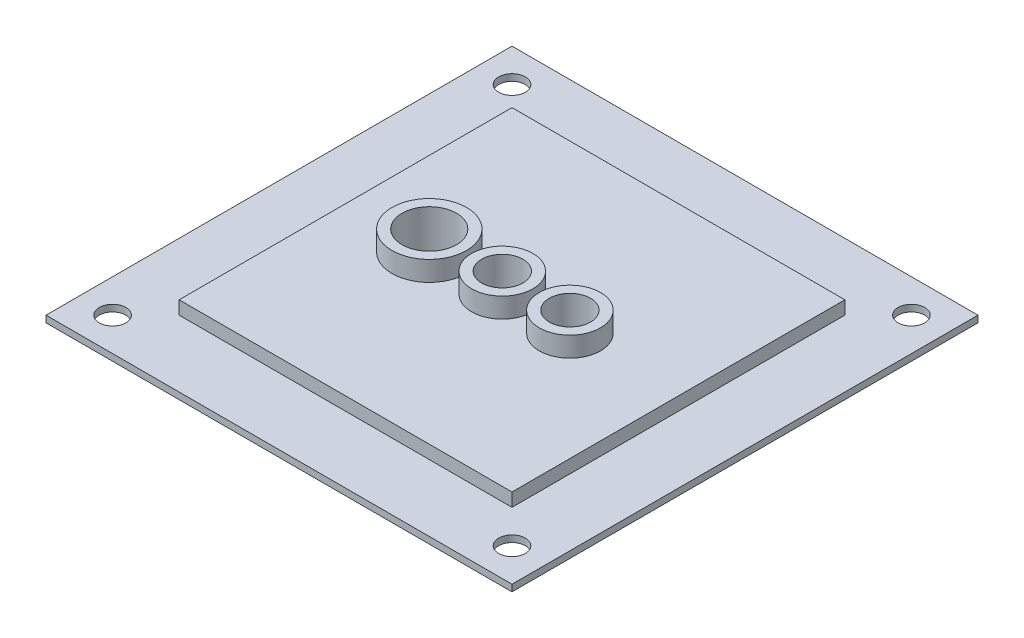
ISO-10303-21;
HEADER;
FILE_DESCRIPTION(('STEP AP214'),'2;1');
FILE_NAME('part.step','',(''),(''),'','','');
FILE_SCHEMA(('AUTOMOTIVE_DESIGN { 1 0 10303 214 1 1 1 1 }'));
ENDSEC;
DATA;
#1=APPLICATION_CONTEXT('core data for automotive mechanical design processes');
#2=APPLICATION_PROTOCOL_DEFINITION('international standard','automotive_design',2000,#1);
#3=PRODUCT_CONTEXT('',#1,'mechanical');
#4=PRODUCT('Part','Part','',(#3));
#5=PRODUCT_RELATED_PRODUCT_CATEGORY('part','',(#4));
#6=PRODUCT_DEFINITION_FORMATION('','',#4);
#7=PRODUCT_DEFINITION_CONTEXT('part definition',#1,'design');
#8=PRODUCT_DEFINITION('design','',#6,#7);
#9=PRODUCT_DEFINITION_SHAPE('','',#8);
#10=(LENGTH_UNIT() NAMED_UNIT(*) SI_UNIT(.MILLI.,.METRE.));
#11=(NAMED_UNIT(*) PLANE_ANGLE_UNIT() SI_UNIT($,.RADIAN.));
#12=(NAMED_UNIT(*) SI_UNIT($,.STERADIAN.) SOLID_ANGLE_UNIT());
#13=UNCERTAINTY_MEASURE_WITH_UNIT(LENGTH_MEASURE(1.E-05),#10,'distance_accuracy_value','');
#14=(GEOMETRIC_REPRESENTATION_CONTEXT(3) GLOBAL_UNCERTAINTY_ASSIGNED_CONTEXT((#13)) GLOBAL_UNIT_ASSIGNED_CONTEXT((#10,
#11,#12)) REPRESENTATION_CONTEXT('',''));
#15=CARTESIAN_POINT('',(0.,0.,0.));
#16=DIRECTION('',(0.,0.,1.));
#17=DIRECTION('',(1.,0.,0.));
#18=AXIS2_PLACEMENT_3D('',#15,#16,#17);
#19=CARTESIAN_POINT('',(-25.,1.5,0.));
#20=DIRECTION('',(1.,0.,0.));
#21=DIRECTION('',(0.,0.,-1.));
#22=AXIS2_PLACEMENT_3D('',#19,#20,#21);
#23=PLANE('',#22);
#24=DIRECTION('',(0.,0.,-1.));
#25=VECTOR('',#24,1.);
#26=CARTESIAN_POINT('',(-25.,-0.5,0.));
#27=LINE('',#26,#25);
#28=CARTESIAN_POINT('',(-25.,-0.5,0.));
#29=VERTEX_POINT('',#28);
#30=CARTESIAN_POINT('',(-25.,-0.5,-50.));
#31=VERTEX_POINT('',#30);
#32=EDGE_CURVE('E69',#29,#31,#27,.T.);
#33=ORIENTED_EDGE('',*,*,#32,.F.);
#34=DIRECTION('',(0.,-1.,0.));
#35=VECTOR('',#34,1.);
#36=CARTESIAN_POINT('',(-25.,1.5,0.));
#37=LINE('',#36,#35);
#38=CARTESIAN_POINT('',(-25.,1.5,0.));
#39=VERTEX_POINT('',#38);
#40=EDGE_CURVE('E12',#39,#29,#37,.T.);
#41=ORIENTED_EDGE('',*,*,#40,.F.);
#42=DIRECTION('',(0.,0.,1.));
#43=VECTOR('',#42,1.);
#44=CARTESIAN_POINT('',(-25.,1.5,0.));
#45=LINE('',#44,#43);
#46=CARTESIAN_POINT('',(-25.,1.5,-50.));
#47=VERTEX_POINT('',#46);
#48=EDGE_CURVE('E211',#47,#39,#45,.T.);
#49=ORIENTED_EDGE('',*,*,#48,.F.);
#50=DIRECTION('',(0.,-1.,0.));
#51=VECTOR('',#50,1.);
#52=CARTESIAN_POINT('',(-25.,1.5,-50.));
#53=LINE('',#52,#51);
#54=EDGE_CURVE('E130',#47,#31,#53,.T.);
#55=ORIENTED_EDGE('',*,*,#54,.T.);
#56=EDGE_LOOP('',(#33,#41,#49,#55));
#57=FACE_BOUND('',#56,.T.);
#58=ADVANCED_FACE('F55',(#57),#23,.F.);
#59=CARTESIAN_POINT('',(25.,1.5,0.));
#60=DIRECTION('',(0.,0.,-1.));
#61=DIRECTION('',(-1.,0.,0.));
#62=AXIS2_PLACEMENT_3D('',#59,#60,#61);
#63=PLANE('',#62);
#64=DIRECTION('',(-1.,0.,0.));
#65=VECTOR('',#64,1.);
#66=CARTESIAN_POINT('',(25.,-0.5,0.));
#67=LINE('',#66,#65);
#68=CARTESIAN_POINT('',(25.,-0.5,0.));
#69=VERTEX_POINT('',#68);
#70=EDGE_CURVE('E75',#69,#29,#67,.T.);
#71=ORIENTED_EDGE('',*,*,#70,.F.);
#72=DIRECTION('',(0.,-1.,0.));
#73=VECTOR('',#72,1.);
#74=CARTESIAN_POINT('',(25.,1.5,0.));
#75=LINE('',#74,#73);
#76=CARTESIAN_POINT('',(25.,1.5,0.));
#77=VERTEX_POINT('',#76);
#78=EDGE_CURVE('E62',#77,#69,#75,.T.);
#79=ORIENTED_EDGE('',*,*,#78,.F.);
#80=DIRECTION('',(1.,0.,0.));
#81=VECTOR('',#80,1.);
#82=CARTESIAN_POINT('',(25.,1.5,0.));
#83=LINE('',#82,#81);
#84=EDGE_CURVE('E214',#39,#77,#83,.T.);
#85=ORIENTED_EDGE('',*,*,#84,.F.);
#86=ORIENTED_EDGE('',*,*,#40,.T.);
#87=EDGE_LOOP('',(#71,#79,#85,#86));
#88=FACE_BOUND('',#87,.T.);
#89=ADVANCED_FACE('F223',(#88),#63,.F.);
#90=CARTESIAN_POINT('',(25.,1.5,0.));
#91=DIRECTION('',(-1.,0.,0.));
#92=DIRECTION('',(0.,0.,1.));
#93=AXIS2_PLACEMENT_3D('',#90,#91,#92);
#94=PLANE('',#93);
#95=DIRECTION('',(0.,0.,1.));
#96=VECTOR('',#95,1.);
#97=CARTESIAN_POINT('',(25.,-0.5,-50.));
#98=LINE('',#97,#96);
#99=CARTESIAN_POINT('',(25.,-0.5,-50.));
#100=VERTEX_POINT('',#99);
#101=EDGE_CURVE('E133',#100,#69,#98,.T.);
#102=ORIENTED_EDGE('',*,*,#101,.F.);
#103=DIRECTION('',(0.,-1.,0.));
#104=VECTOR('',#103,1.);
#105=CARTESIAN_POINT('',(25.,1.5,-50.));
#106=LINE('',#105,#104);
#107=CARTESIAN_POINT('',(25.,1.5,-50.));
#108=VERTEX_POINT('',#107);
#109=EDGE_CURVE('E121',#108,#100,#106,.T.);
#110=ORIENTED_EDGE('',*,*,#109,.F.);
#111=DIRECTION('',(0.,0.,-1.));
#112=VECTOR('',#111,1.);
#113=CARTESIAN_POINT('',(25.,1.5,0.));
#114=LINE('',#113,#112);
#115=EDGE_CURVE('E216',#77,#108,#114,.T.);
#116=ORIENTED_EDGE('',*,*,#115,.F.);
#117=ORIENTED_EDGE('',*,*,#78,.T.);
#118=EDGE_LOOP('',(#102,#110,#116,#117));
#119=FACE_BOUND('',#118,.T.);
#120=ADVANCED_FACE('F134',(#119),#94,.F.);
#121=CARTESIAN_POINT('',(25.,1.5,-50.));
#122=DIRECTION('',(0.,0.,1.));
#123=DIRECTION('',(1.,0.,0.));
#124=AXIS2_PLACEMENT_3D('',#121,#122,#123);
#125=PLANE('',#124);
#126=DIRECTION('',(1.,0.,0.));
#127=VECTOR('',#126,1.);
#128=CARTESIAN_POINT('',(-25.,-0.5,-50.));
#129=LINE('',#128,#127);
#130=EDGE_CURVE('E126',#31,#100,#129,.T.);
#131=ORIENTED_EDGE('',*,*,#130,.F.);
#132=ORIENTED_EDGE('',*,*,#54,.F.);
#133=DIRECTION('',(-1.,0.,0.));
#134=VECTOR('',#133,1.);
#135=CARTESIAN_POINT('',(25.,1.5,-50.));
#136=LINE('',#135,#134);
#137=EDGE_CURVE('E127',#108,#47,#136,.T.);
#138=ORIENTED_EDGE('',*,*,#137,.F.);
#139=ORIENTED_EDGE('',*,*,#109,.T.);
#140=EDGE_LOOP('',(#131,#132,#138,#139));
#141=FACE_BOUND('',#140,.T.);
#142=ADVANCED_FACE('F123',(#141),#125,.F.);
#143=CARTESIAN_POINT('',(0.,1.5,0.));
#144=DIRECTION('',(0.,1.,0.));
#145=DIRECTION('',(0.,0.,1.));
#146=AXIS2_PLACEMENT_3D('',#143,#144,#145);
#147=PLANE('',#146);
#148=CARTESIAN_POINT('',(8.6987242182313,1.5,-25.));
#149=DIRECTION('',(0.,1.,0.));
#150=DIRECTION('',(1.,0.,0.));
#151=AXIS2_PLACEMENT_3D('',#148,#149,#150);
#152=CIRCLE('',#151,4.6);
#153=CARTESIAN_POINT('',(13.2987242182313,1.5,-25.));
#154=VERTEX_POINT('',#153);
#155=EDGE_CURVE('E185',#154,#154,#152,.T.);
#156=ORIENTED_EDGE('',*,*,#155,.F.);
#157=EDGE_LOOP('',(#156));
#158=FACE_BOUND('',#157,.T.);
#159=ORIENTED_EDGE('',*,*,#48,.T.);
#160=ORIENTED_EDGE('',*,*,#84,.T.);
#161=ORIENTED_EDGE('',*,*,#115,.T.);
#162=ORIENTED_EDGE('',*,*,#137,.T.);
#163=EDGE_LOOP('',(#159,#160,#161,#162));
#164=FACE_BOUND('',#163,.T.);
#165=CARTESIAN_POINT('',(-12.4265926724716,1.5,-25.));
#166=DIRECTION('',(0.,1.,0.));
#167=DIRECTION('',(1.,0.,0.));
#168=AXIS2_PLACEMENT_3D('',#165,#166,#167);
#169=CIRCLE('',#168,5.6);
#170=CARTESIAN_POINT('',(-6.82659267247165,1.5,-25.));
#171=VERTEX_POINT('',#170);
#172=EDGE_CURVE('E196',#171,#171,#169,.T.);
#173=ORIENTED_EDGE('',*,*,#172,.F.);
#174=EDGE_LOOP('',(#173));
#175=FACE_BOUND('',#174,.T.);
#176=CARTESIAN_POINT('',(-1.46077932462585,1.5,-25.));
#177=DIRECTION('',(0.,1.,0.));
#178=DIRECTION('',(1.,0.,0.));
#179=AXIS2_PLACEMENT_3D('',#176,#177,#178);
#180=CIRCLE('',#179,4.6);
#181=CARTESIAN_POINT('',(3.13922067537415,1.5,-25.));
#182=VERTEX_POINT('',#181);
#183=EDGE_CURVE('E176',#182,#182,#180,.T.);
#184=ORIENTED_EDGE('',*,*,#183,.F.);
#185=EDGE_LOOP('',(#184));
#186=FACE_BOUND('',#185,.T.);
#187=ADVANCED_FACE('F221',(#158,#164,#175,#186),#147,.T.);
#188=CARTESIAN_POINT('',(0.,-1.5,0.));
#189=DIRECTION('',(0.,1.,0.));
#190=DIRECTION('',(0.,0.,1.));
#191=AXIS2_PLACEMENT_3D('',#188,#189,#190);
#192=PLANE('',#191);
#193=CARTESIAN_POINT('',(-12.4265926724716,-1.5,-25.));
#194=DIRECTION('',(0.,1.,0.));
#195=DIRECTION('',(0.,0.,1.));
#196=AXIS2_PLACEMENT_3D('',#193,#194,#195);
#197=CIRCLE('',#196,4.1);
#198=CARTESIAN_POINT('',(-12.4265926724716,-1.5,-20.9));
#199=VERTEX_POINT('',#198);
#200=EDGE_CURVE('E208',#199,#199,#197,.T.);
#201=ORIENTED_EDGE('',*,*,#200,.T.);
#202=EDGE_LOOP('',(#201));
#203=FACE_BOUND('',#202,.T.);
#204=CARTESIAN_POINT('',(8.6987242182313,-1.5,-25.));
#205=DIRECTION('',(0.,1.,0.));
#206=DIRECTION('',(0.,0.,1.));
#207=AXIS2_PLACEMENT_3D('',#204,#205,#206);
#208=CIRCLE('',#207,3.1);
#209=CARTESIAN_POINT('',(8.6987242182313,-1.5,-21.9));
#210=VERTEX_POINT('',#209);
#211=EDGE_CURVE('E205',#210,#210,#208,.T.);
#212=ORIENTED_EDGE('',*,*,#211,.T.);
#213=EDGE_LOOP('',(#212));
#214=FACE_BOUND('',#213,.T.);
#215=CARTESIAN_POINT('',(-1.46077932462585,-1.5,-25.));
#216=DIRECTION('',(0.,1.,0.));
#217=DIRECTION('',(0.,0.,1.));
#218=AXIS2_PLACEMENT_3D('',#215,#216,#217);
#219=CIRCLE('',#218,3.1);
#220=CARTESIAN_POINT('',(-1.46077932462585,-1.5,-21.9));
#221=VERTEX_POINT('',#220);
#222=EDGE_CURVE('E200',#221,#221,#219,.T.);
#223=ORIENTED_EDGE('',*,*,#222,.T.);
#224=EDGE_LOOP('',(#223));
#225=FACE_BOUND('',#224,.T.);
#226=CARTESIAN_POINT('',(-30.,-1.5,-55.));
#227=DIRECTION('',(0.,-1.,0.));
#228=DIRECTION('',(0.,0.,-1.));
#229=AXIS2_PLACEMENT_3D('',#226,#227,#228);
#230=CIRCLE('',#229,2.);
#231=CARTESIAN_POINT('',(-30.,-1.5,-57.));
#232=VERTEX_POINT('',#231);
#233=EDGE_CURVE('E318',#232,#232,#230,.T.);
#234=ORIENTED_EDGE('',*,*,#233,.F.);
#235=EDGE_LOOP('',(#234));
#236=FACE_BOUND('',#235,.T.);
#237=CARTESIAN_POINT('',(30.,-1.5,-55.));
#238=DIRECTION('',(0.,-1.,0.));
#239=DIRECTION('',(0.,0.,-1.));
#240=AXIS2_PLACEMENT_3D('',#237,#238,#239);
#241=CIRCLE('',#240,2.);
#242=CARTESIAN_POINT('',(30.,-1.5,-57.));
#243=VERTEX_POINT('',#242);
#244=EDGE_CURVE('E321',#243,#243,#241,.T.);
#245=ORIENTED_EDGE('',*,*,#244,.F.);
#246=EDGE_LOOP('',(#245));
#247=FACE_BOUND('',#246,.T.);
#248=CARTESIAN_POINT('',(30.,-1.5,5.));
#249=DIRECTION('',(0.,-1.,0.));
#250=DIRECTION('',(0.,0.,-1.));
#251=AXIS2_PLACEMENT_3D('',#248,#249,#250);
#252=CIRCLE('',#251,2.);
#253=CARTESIAN_POINT('',(30.,-1.5,3.));
#254=VERTEX_POINT('',#253);
#255=EDGE_CURVE('E327',#254,#254,#252,.T.);
#256=ORIENTED_EDGE('',*,*,#255,.F.);
#257=EDGE_LOOP('',(#256));
#258=FACE_BOUND('',#257,.T.);
#259=CARTESIAN_POINT('',(-30.,-1.5,5.));
#260=DIRECTION('',(0.,-1.,0.));
#261=DIRECTION('',(0.,0.,-1.));
#262=AXIS2_PLACEMENT_3D('',#259,#260,#261);
#263=CIRCLE('',#262,2.);
#264=CARTESIAN_POINT('',(-30.,-1.5,3.));
#265=VERTEX_POINT('',#264);
#266=EDGE_CURVE('E333',#265,#265,#263,.T.);
#267=ORIENTED_EDGE('',*,*,#266,.F.);
#268=EDGE_LOOP('',(#267));
#269=FACE_BOUND('',#268,.T.);
#270=DIRECTION('',(-1.,0.,0.));
#271=VECTOR('',#270,1.);
#272=CARTESIAN_POINT('',(35.,-1.5,10.));
#273=LINE('',#272,#271);
#274=CARTESIAN_POINT('',(35.,-1.5,10.));
#275=VERTEX_POINT('',#274);
#276=CARTESIAN_POINT('',(-35.,-1.5,9.99999999999999));
#277=VERTEX_POINT('',#276);
#278=EDGE_CURVE('E136',#275,#277,#273,.T.);
#279=ORIENTED_EDGE('',*,*,#278,.T.);
#280=DIRECTION('',(0.,0.,-1.));
#281=VECTOR('',#280,1.);
#282=CARTESIAN_POINT('',(-35.,-1.5,9.99999999999999));
#283=LINE('',#282,#281);
#284=CARTESIAN_POINT('',(-35.,-1.5,-60.));
#285=VERTEX_POINT('',#284);
#286=EDGE_CURVE('E160',#277,#285,#283,.T.);
#287=ORIENTED_EDGE('',*,*,#286,.T.);
#288=DIRECTION('',(1.,0.,0.));
#289=VECTOR('',#288,1.);
#290=CARTESIAN_POINT('',(-35.,-1.5,-60.));
#291=LINE('',#290,#289);
#292=CARTESIAN_POINT('',(35.,-1.5,-60.));
#293=VERTEX_POINT('',#292);
#294=EDGE_CURVE('E163',#285,#293,#291,.T.);
#295=ORIENTED_EDGE('',*,*,#294,.T.);
#296=DIRECTION('',(0.,0.,1.));
#297=VECTOR('',#296,1.);
#298=CARTESIAN_POINT('',(35.,-1.5,-60.));
#299=LINE('',#298,#297);
#300=EDGE_CURVE('E148',#293,#275,#299,.T.);
#301=ORIENTED_EDGE('',*,*,#300,.T.);
#302=EDGE_LOOP('',(#279,#287,#295,#301));
#303=FACE_BOUND('',#302,.T.);
#304=ADVANCED_FACE('F233',(#203,#214,#225,#236,#247,#258,#269,#303),#192,.F.);
#305=CARTESIAN_POINT('',(-12.4265926724716,1.5,-25.));
#306=DIRECTION('',(0.,-1.,0.));
#307=DIRECTION('',(0.,0.,-1.));
#308=AXIS2_PLACEMENT_3D('',#305,#306,#307);
#309=CYLINDRICAL_SURFACE('',#308,4.1);
#310=ORIENTED_EDGE('',*,*,#200,.F.);
#311=EDGE_LOOP('',(#310));
#312=FACE_BOUND('',#311,.T.);
#313=CARTESIAN_POINT('',(-12.4265926724716,4.5,-25.));
#314=DIRECTION('',(0.,1.,0.));
#315=DIRECTION('',(0.,0.,1.));
#316=AXIS2_PLACEMENT_3D('',#313,#314,#315);
#317=CIRCLE('',#316,4.1);
#318=CARTESIAN_POINT('',(-12.4265926724716,4.5,-20.9));
#319=VERTEX_POINT('',#318);
#320=EDGE_CURVE('E193',#319,#319,#317,.T.);
#321=ORIENTED_EDGE('',*,*,#320,.T.);
#322=EDGE_LOOP('',(#321));
#323=FACE_BOUND('',#322,.T.);
#324=ADVANCED_FACE('F236',(#312,#323),#309,.F.);
#325=CARTESIAN_POINT('',(8.6987242182313,1.5,-25.));
#326=DIRECTION('',(0.,-1.,0.));
#327=DIRECTION('',(0.,0.,-1.));
#328=AXIS2_PLACEMENT_3D('',#325,#326,#327);
#329=CYLINDRICAL_SURFACE('',#328,3.1);
#330=ORIENTED_EDGE('',*,*,#211,.F.);
#331=EDGE_LOOP('',(#330));
#332=FACE_BOUND('',#331,.T.);
#333=CARTESIAN_POINT('',(8.6987242182313,4.5,-25.));
#334=DIRECTION('',(0.,1.,0.));
#335=DIRECTION('',(0.,0.,1.));
#336=AXIS2_PLACEMENT_3D('',#333,#334,#335);
#337=CIRCLE('',#336,3.1);
#338=CARTESIAN_POINT('',(8.6987242182313,4.5,-21.9));
#339=VERTEX_POINT('',#338);
#340=EDGE_CURVE('E188',#339,#339,#337,.T.);
#341=ORIENTED_EDGE('',*,*,#340,.T.);
#342=EDGE_LOOP('',(#341));
#343=FACE_BOUND('',#342,.T.);
#344=ADVANCED_FACE('F243',(#332,#343),#329,.F.);
#345=CARTESIAN_POINT('',(-1.46077932462585,1.5,-25.));
#346=DIRECTION('',(0.,-1.,0.));
#347=DIRECTION('',(0.,0.,-1.));
#348=AXIS2_PLACEMENT_3D('',#345,#346,#347);
#349=CYLINDRICAL_SURFACE('',#348,3.1);
#350=ORIENTED_EDGE('',*,*,#222,.F.);
#351=EDGE_LOOP('',(#350));
#352=FACE_BOUND('',#351,.T.);
#353=CARTESIAN_POINT('',(-1.46077932462585,4.5,-25.));
#354=DIRECTION('',(0.,1.,0.));
#355=DIRECTION('',(0.,0.,1.));
#356=AXIS2_PLACEMENT_3D('',#353,#354,#355);
#357=CIRCLE('',#356,3.1);
#358=CARTESIAN_POINT('',(-1.46077932462585,4.5,-21.9));
#359=VERTEX_POINT('',#358);
#360=EDGE_CURVE('E179',#359,#359,#357,.T.);
#361=ORIENTED_EDGE('',*,*,#360,.T.);
#362=EDGE_LOOP('',(#361));
#363=FACE_BOUND('',#362,.T.);
#364=ADVANCED_FACE('F247',(#352,#363),#349,.F.);
#365=CARTESIAN_POINT('',(-12.4265926724716,4.5,-25.));
#366=DIRECTION('',(0.,1.,0.));
#367=DIRECTION('',(0.,0.,1.));
#368=AXIS2_PLACEMENT_3D('',#365,#366,#367);
#369=PLANE('',#368);
#370=CARTESIAN_POINT('',(-12.4265926724716,4.5,-25.));
#371=DIRECTION('',(0.,1.,0.));
#372=DIRECTION('',(1.,0.,0.));
#373=AXIS2_PLACEMENT_3D('',#370,#371,#372);
#374=CIRCLE('',#373,5.6);
#375=CARTESIAN_POINT('',(-6.82659267247165,4.5,-25.));
#376=VERTEX_POINT('',#375);
#377=EDGE_CURVE('E197',#376,#376,#374,.T.);
#378=ORIENTED_EDGE('',*,*,#377,.T.);
#379=EDGE_LOOP('',(#378));
#380=FACE_BOUND('',#379,.T.);
#381=ORIENTED_EDGE('',*,*,#320,.F.);
#382=EDGE_LOOP('',(#381));
#383=FACE_BOUND('',#382,.T.);
#384=ADVANCED_FACE('F251',(#380,#383),#369,.T.);
#385=CARTESIAN_POINT('',(-12.4265926724716,4.5,-25.));
#386=DIRECTION('',(0.,-1.,0.));
#387=DIRECTION('',(0.,0.,-1.));
#388=AXIS2_PLACEMENT_3D('',#385,#386,#387);
#389=CYLINDRICAL_SURFACE('',#388,5.6);
#390=ORIENTED_EDGE('',*,*,#377,.F.);
#391=EDGE_LOOP('',(#390));
#392=FACE_BOUND('',#391,.T.);
#393=ORIENTED_EDGE('',*,*,#172,.T.);
#394=EDGE_LOOP('',(#393));
#395=FACE_BOUND('',#394,.T.);
#396=ADVANCED_FACE('F253',(#392,#395),#389,.T.);
#397=CARTESIAN_POINT('',(8.6987242182313,4.5,-25.));
#398=DIRECTION('',(0.,1.,0.));
#399=DIRECTION('',(0.,0.,1.));
#400=AXIS2_PLACEMENT_3D('',#397,#398,#399);
#401=PLANE('',#400);
#402=CARTESIAN_POINT('',(8.6987242182313,4.5,-25.));
#403=DIRECTION('',(0.,1.,0.));
#404=DIRECTION('',(1.,0.,0.));
#405=AXIS2_PLACEMENT_3D('',#402,#403,#404);
#406=CIRCLE('',#405,4.6);
#407=CARTESIAN_POINT('',(13.2987242182313,4.5,-25.));
#408=VERTEX_POINT('',#407);
#409=EDGE_CURVE('E184',#408,#408,#406,.T.);
#410=ORIENTED_EDGE('',*,*,#409,.T.);
#411=EDGE_LOOP('',(#410));
#412=FACE_BOUND('',#411,.T.);
#413=ORIENTED_EDGE('',*,*,#340,.F.);
#414=EDGE_LOOP('',(#413));
#415=FACE_BOUND('',#414,.T.);
#416=ADVANCED_FACE('F256',(#412,#415),#401,.T.);
#417=CARTESIAN_POINT('',(8.6987242182313,4.5,-25.));
#418=DIRECTION('',(0.,-1.,0.));
#419=DIRECTION('',(0.,0.,-1.));
#420=AXIS2_PLACEMENT_3D('',#417,#418,#419);
#421=CYLINDRICAL_SURFACE('',#420,4.6);
#422=ORIENTED_EDGE('',*,*,#409,.F.);
#423=EDGE_LOOP('',(#422));
#424=FACE_BOUND('',#423,.T.);
#425=ORIENTED_EDGE('',*,*,#155,.T.);
#426=EDGE_LOOP('',(#425));
#427=FACE_BOUND('',#426,.T.);
#428=ADVANCED_FACE('F263',(#424,#427),#421,.T.);
#429=CARTESIAN_POINT('',(-1.46077932462585,4.5,-25.));
#430=DIRECTION('',(0.,1.,0.));
#431=DIRECTION('',(0.,0.,1.));
#432=AXIS2_PLACEMENT_3D('',#429,#430,#431);
#433=PLANE('',#432);
#434=CARTESIAN_POINT('',(-1.46077932462585,4.5,-25.));
#435=DIRECTION('',(0.,1.,0.));
#436=DIRECTION('',(1.,0.,0.));
#437=AXIS2_PLACEMENT_3D('',#434,#435,#436);
#438=CIRCLE('',#437,4.6);
#439=CARTESIAN_POINT('',(3.13922067537415,4.5,-25.));
#440=VERTEX_POINT('',#439);
#441=EDGE_CURVE('E170',#440,#440,#438,.T.);
#442=ORIENTED_EDGE('',*,*,#441,.T.);
#443=EDGE_LOOP('',(#442));
#444=FACE_BOUND('',#443,.T.);
#445=ORIENTED_EDGE('',*,*,#360,.F.);
#446=EDGE_LOOP('',(#445));
#447=FACE_BOUND('',#446,.T.);
#448=ADVANCED_FACE('F267',(#444,#447),#433,.T.);
#449=CARTESIAN_POINT('',(-1.46077932462585,4.5,-25.));
#450=DIRECTION('',(0.,-1.,0.));
#451=DIRECTION('',(0.,0.,-1.));
#452=AXIS2_PLACEMENT_3D('',#449,#450,#451);
#453=CYLINDRICAL_SURFACE('',#452,4.6);
#454=ORIENTED_EDGE('',*,*,#441,.F.);
#455=EDGE_LOOP('',(#454));
#456=FACE_BOUND('',#455,.T.);
#457=ORIENTED_EDGE('',*,*,#183,.T.);
#458=EDGE_LOOP('',(#457));
#459=FACE_BOUND('',#458,.T.);
#460=ADVANCED_FACE('F271',(#456,#459),#453,.T.);
#461=CARTESIAN_POINT('',(35.,-0.5,10.));
#462=DIRECTION('',(0.,0.,1.));
#463=DIRECTION('',(1.,0.,0.));
#464=AXIS2_PLACEMENT_3D('',#461,#462,#463);
#465=PLANE('',#464);
#466=ORIENTED_EDGE('',*,*,#278,.F.);
#467=DIRECTION('',(0.,-1.,0.));
#468=VECTOR('',#467,1.);
#469=CARTESIAN_POINT('',(35.,-0.5,10.));
#470=LINE('',#469,#468);
#471=CARTESIAN_POINT('',(35.,-0.5,10.));
#472=VERTEX_POINT('',#471);
#473=EDGE_CURVE('E168',#472,#275,#470,.T.);
#474=ORIENTED_EDGE('',*,*,#473,.F.);
#475=DIRECTION('',(-1.,0.,0.));
#476=VECTOR('',#475,1.);
#477=CARTESIAN_POINT('',(35.,-0.5,10.));
#478=LINE('',#477,#476);
#479=CARTESIAN_POINT('',(-35.,-0.5,9.99999999999999));
#480=VERTEX_POINT('',#479);
#481=EDGE_CURVE('E144',#472,#480,#478,.T.);
#482=ORIENTED_EDGE('',*,*,#481,.T.);
#483=DIRECTION('',(0.,-1.,0.));
#484=VECTOR('',#483,1.);
#485=CARTESIAN_POINT('',(-35.,-0.5,9.99999999999999));
#486=LINE('',#485,#484);
#487=EDGE_CURVE('E157',#480,#277,#486,.T.);
#488=ORIENTED_EDGE('',*,*,#487,.T.);
#489=EDGE_LOOP('',(#466,#474,#482,#488));
#490=FACE_BOUND('',#489,.T.);
#491=ADVANCED_FACE('F275',(#490),#465,.T.);
#492=CARTESIAN_POINT('',(35.,-0.5,-60.));
#493=DIRECTION('',(1.,0.,0.));
#494=DIRECTION('',(0.,0.,-1.));
#495=AXIS2_PLACEMENT_3D('',#492,#493,#494);
#496=PLANE('',#495);
#497=ORIENTED_EDGE('',*,*,#300,.F.);
#498=DIRECTION('',(0.,-1.,0.));
#499=VECTOR('',#498,1.);
#500=CARTESIAN_POINT('',(35.,-0.5,-60.));
#501=LINE('',#500,#499);
#502=CARTESIAN_POINT('',(35.,-0.5,-60.));
#503=VERTEX_POINT('',#502);
#504=EDGE_CURVE('E171',#503,#293,#501,.T.);
#505=ORIENTED_EDGE('',*,*,#504,.F.);
#506=DIRECTION('',(0.,0.,1.));
#507=VECTOR('',#506,1.);
#508=CARTESIAN_POINT('',(35.,-0.5,-60.));
#509=LINE('',#508,#507);
#510=EDGE_CURVE('E154',#503,#472,#509,.T.);
#511=ORIENTED_EDGE('',*,*,#510,.T.);
#512=ORIENTED_EDGE('',*,*,#473,.T.);
#513=EDGE_LOOP('',(#497,#505,#511,#512));
#514=FACE_BOUND('',#513,.T.);
#515=ADVANCED_FACE('F279',(#514),#496,.T.);
#516=CARTESIAN_POINT('',(-35.,-0.5,-60.));
#517=DIRECTION('',(0.,0.,-1.));
#518=DIRECTION('',(-1.,0.,0.));
#519=AXIS2_PLACEMENT_3D('',#516,#517,#518);
#520=PLANE('',#519);
#521=ORIENTED_EDGE('',*,*,#294,.F.);
#522=DIRECTION('',(0.,-1.,0.));
#523=VECTOR('',#522,1.);
#524=CARTESIAN_POINT('',(-35.,-0.5,-60.));
#525=LINE('',#524,#523);
#526=CARTESIAN_POINT('',(-35.,-0.5,-60.));
#527=VERTEX_POINT('',#526);
#528=EDGE_CURVE('E173',#527,#285,#525,.T.);
#529=ORIENTED_EDGE('',*,*,#528,.F.);
#530=DIRECTION('',(1.,0.,0.));
#531=VECTOR('',#530,1.);
#532=CARTESIAN_POINT('',(-35.,-0.5,-60.));
#533=LINE('',#532,#531);
#534=EDGE_CURVE('E151',#527,#503,#533,.T.);
#535=ORIENTED_EDGE('',*,*,#534,.T.);
#536=ORIENTED_EDGE('',*,*,#504,.T.);
#537=EDGE_LOOP('',(#521,#529,#535,#536));
#538=FACE_BOUND('',#537,.T.);
#539=ADVANCED_FACE('F284',(#538),#520,.T.);
#540=CARTESIAN_POINT('',(-35.,-0.5,9.99999999999999));
#541=DIRECTION('',(-1.,0.,0.));
#542=DIRECTION('',(0.,0.,1.));
#543=AXIS2_PLACEMENT_3D('',#540,#541,#542);
#544=PLANE('',#543);
#545=ORIENTED_EDGE('',*,*,#286,.F.);
#546=ORIENTED_EDGE('',*,*,#487,.F.);
#547=DIRECTION('',(0.,0.,-1.));
#548=VECTOR('',#547,1.);
#549=CARTESIAN_POINT('',(-35.,-0.5,9.99999999999999));
#550=LINE('',#549,#548);
#551=EDGE_CURVE('E147',#480,#527,#550,.T.);
#552=ORIENTED_EDGE('',*,*,#551,.T.);
#553=ORIENTED_EDGE('',*,*,#528,.T.);
#554=EDGE_LOOP('',(#545,#546,#552,#553));
#555=FACE_BOUND('',#554,.T.);
#556=ADVANCED_FACE('F281',(#555),#544,.T.);
#557=CARTESIAN_POINT('',(0.,-0.5,0.));
#558=DIRECTION('',(0.,-1.,0.));
#559=DIRECTION('',(0.,0.,-1.));
#560=AXIS2_PLACEMENT_3D('',#557,#558,#559);
#561=PLANE('',#560);
#562=CARTESIAN_POINT('',(-30.,-0.5,-55.));
#563=DIRECTION('',(0.,-1.,0.));
#564=DIRECTION('',(0.,0.,-1.));
#565=AXIS2_PLACEMENT_3D('',#562,#563,#564);
#566=CIRCLE('',#565,2.);
#567=CARTESIAN_POINT('',(-30.,-0.5,-57.));
#568=VERTEX_POINT('',#567);
#569=EDGE_CURVE('E315',#568,#568,#566,.T.);
#570=ORIENTED_EDGE('',*,*,#569,.T.);
#571=EDGE_LOOP('',(#570));
#572=FACE_BOUND('',#571,.T.);
#573=CARTESIAN_POINT('',(30.,-0.5,-55.));
#574=DIRECTION('',(0.,-1.,0.));
#575=DIRECTION('',(0.,0.,-1.));
#576=AXIS2_PLACEMENT_3D('',#573,#574,#575);
#577=CIRCLE('',#576,2.);
#578=CARTESIAN_POINT('',(30.,-0.5,-57.));
#579=VERTEX_POINT('',#578);
#580=EDGE_CURVE('E324',#579,#579,#577,.T.);
#581=ORIENTED_EDGE('',*,*,#580,.T.);
#582=EDGE_LOOP('',(#581));
#583=FACE_BOUND('',#582,.T.);
#584=CARTESIAN_POINT('',(30.,-0.5,5.));
#585=DIRECTION('',(0.,-1.,0.));
#586=DIRECTION('',(0.,0.,-1.));
#587=AXIS2_PLACEMENT_3D('',#584,#585,#586);
#588=CIRCLE('',#587,2.);
#589=CARTESIAN_POINT('',(30.,-0.5,3.));
#590=VERTEX_POINT('',#589);
#591=EDGE_CURVE('E330',#590,#590,#588,.T.);
#592=ORIENTED_EDGE('',*,*,#591,.T.);
#593=EDGE_LOOP('',(#592));
#594=FACE_BOUND('',#593,.T.);
#595=CARTESIAN_POINT('',(-30.,-0.5,5.));
#596=DIRECTION('',(0.,-1.,0.));
#597=DIRECTION('',(0.,0.,-1.));
#598=AXIS2_PLACEMENT_3D('',#595,#596,#597);
#599=CIRCLE('',#598,2.);
#600=CARTESIAN_POINT('',(-30.,-0.5,3.));
#601=VERTEX_POINT('',#600);
#602=EDGE_CURVE('E336',#601,#601,#599,.T.);
#603=ORIENTED_EDGE('',*,*,#602,.T.);
#604=EDGE_LOOP('',(#603));
#605=FACE_BOUND('',#604,.T.);
#606=ORIENTED_EDGE('',*,*,#101,.T.);
#607=ORIENTED_EDGE('',*,*,#70,.T.);
#608=ORIENTED_EDGE('',*,*,#32,.T.);
#609=ORIENTED_EDGE('',*,*,#130,.T.);
#610=EDGE_LOOP('',(#606,#607,#608,#609));
#611=FACE_BOUND('',#610,.T.);
#612=ORIENTED_EDGE('',*,*,#481,.F.);
#613=ORIENTED_EDGE('',*,*,#510,.F.);
#614=ORIENTED_EDGE('',*,*,#534,.F.);
#615=ORIENTED_EDGE('',*,*,#551,.F.);
#616=EDGE_LOOP('',(#612,#613,#614,#615));
#617=FACE_BOUND('',#616,.T.);
#618=ADVANCED_FACE('F138',(#572,#583,#594,#605,#611,#617),#561,.F.);
#619=CARTESIAN_POINT('',(-30.,-0.5,5.));
#620=DIRECTION('',(0.,-1.,0.));
#621=DIRECTION('',(0.,0.,-1.));
#622=AXIS2_PLACEMENT_3D('',#619,#620,#621);
#623=CYLINDRICAL_SURFACE('',#622,2.);
#624=ORIENTED_EDGE('',*,*,#602,.F.);
#625=EDGE_LOOP('',(#624));
#626=FACE_BOUND('',#625,.T.);
#627=ORIENTED_EDGE('',*,*,#266,.T.);
#628=EDGE_LOOP('',(#627));
#629=FACE_BOUND('',#628,.T.);
#630=ADVANCED_FACE('F294',(#626,#629),#623,.F.);
#631=CARTESIAN_POINT('',(30.,-0.5,5.));
#632=DIRECTION('',(0.,-1.,0.));
#633=DIRECTION('',(0.,0.,-1.));
#634=AXIS2_PLACEMENT_3D('',#631,#632,#633);
#635=CYLINDRICAL_SURFACE('',#634,2.);
#636=ORIENTED_EDGE('',*,*,#591,.F.);
#637=EDGE_LOOP('',(#636));
#638=FACE_BOUND('',#637,.T.);
#639=ORIENTED_EDGE('',*,*,#255,.T.);
#640=EDGE_LOOP('',(#639));
#641=FACE_BOUND('',#640,.T.);
#642=ADVANCED_FACE('F298',(#638,#641),#635,.F.);
#643=CARTESIAN_POINT('',(30.,-0.5,-55.));
#644=DIRECTION('',(0.,-1.,0.));
#645=DIRECTION('',(0.,0.,-1.));
#646=AXIS2_PLACEMENT_3D('',#643,#644,#645);
#647=CYLINDRICAL_SURFACE('',#646,2.);
#648=ORIENTED_EDGE('',*,*,#580,.F.);
#649=EDGE_LOOP('',(#648));
#650=FACE_BOUND('',#649,.T.);
#651=ORIENTED_EDGE('',*,*,#244,.T.);
#652=EDGE_LOOP('',(#651));
#653=FACE_BOUND('',#652,.T.);
#654=ADVANCED_FACE('F302',(#650,#653),#647,.F.);
#655=CARTESIAN_POINT('',(-30.,-0.5,-55.));
#656=DIRECTION('',(0.,-1.,0.));
#657=DIRECTION('',(0.,0.,-1.));
#658=AXIS2_PLACEMENT_3D('',#655,#656,#657);
#659=CYLINDRICAL_SURFACE('',#658,2.);
#660=ORIENTED_EDGE('',*,*,#569,.F.);
#661=EDGE_LOOP('',(#660));
#662=FACE_BOUND('',#661,.T.);
#663=ORIENTED_EDGE('',*,*,#233,.T.);
#664=EDGE_LOOP('',(#663));
#665=FACE_BOUND('',#664,.T.);
#666=ADVANCED_FACE('F306',(#662,#665),#659,.F.);
#667=CLOSED_SHELL('',(#58,#89,#120,#142,#187,#304,#324,#344,#364,#384,#396,#416,#428,#448,#460,
#491,#515,#539,#556,#618,#630,#642,#654,#666));
#668=MANIFOLD_SOLID_BREP('B2',#667);
#669=ADVANCED_BREP_SHAPE_REPRESENTATION('',(#18,#668),#14);
#670=SHAPE_DEFINITION_REPRESENTATION(#9,#669);
ENDSEC;
END-ISO-10303-21;
